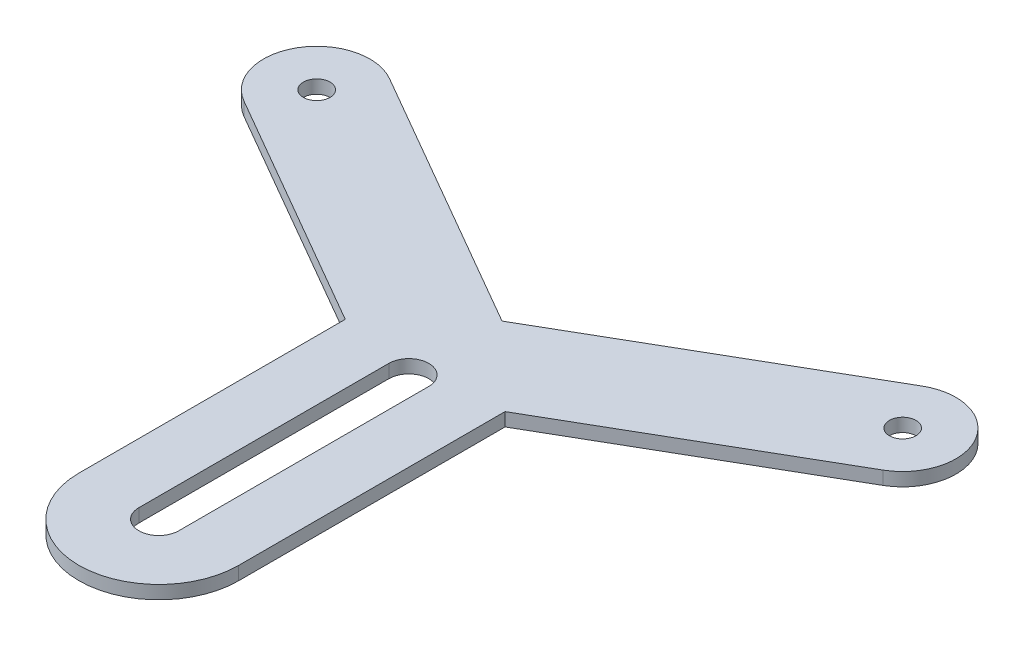
ISO-10303-21;
HEADER;
FILE_DESCRIPTION(('STEP AP214'),'2;1');
FILE_NAME('part.step','',(''),(''),'','','');
FILE_SCHEMA(('AUTOMOTIVE_DESIGN { 1 0 10303 214 1 1 1 1 }'));
ENDSEC;
DATA;
#1=APPLICATION_CONTEXT('core data for automotive mechanical design processes');
#2=APPLICATION_PROTOCOL_DEFINITION('international standard','automotive_design',2000,#1);
#3=PRODUCT_CONTEXT('',#1,'mechanical');
#4=PRODUCT('Part','Part','',(#3));
#5=PRODUCT_RELATED_PRODUCT_CATEGORY('part','',(#4));
#6=PRODUCT_DEFINITION_FORMATION('','',#4);
#7=PRODUCT_DEFINITION_CONTEXT('part definition',#1,'design');
#8=PRODUCT_DEFINITION('design','',#6,#7);
#9=PRODUCT_DEFINITION_SHAPE('','',#8);
#10=(LENGTH_UNIT() NAMED_UNIT(*) SI_UNIT(.MILLI.,.METRE.));
#11=(NAMED_UNIT(*) PLANE_ANGLE_UNIT() SI_UNIT($,.RADIAN.));
#12=(NAMED_UNIT(*) SI_UNIT($,.STERADIAN.) SOLID_ANGLE_UNIT());
#13=UNCERTAINTY_MEASURE_WITH_UNIT(LENGTH_MEASURE(1.E-05),#10,'distance_accuracy_value','');
#14=(GEOMETRIC_REPRESENTATION_CONTEXT(3) GLOBAL_UNCERTAINTY_ASSIGNED_CONTEXT((#13)) GLOBAL_UNIT_ASSIGNED_CONTEXT((#10,
#11,#12)) REPRESENTATION_CONTEXT('',''));
#15=CARTESIAN_POINT('',(0.,0.,0.));
#16=DIRECTION('',(0.,0.,1.));
#17=DIRECTION('',(1.,0.,0.));
#18=AXIS2_PLACEMENT_3D('',#15,#16,#17);
#19=CARTESIAN_POINT('',(-139.7,6.35,0.));
#20=DIRECTION('',(0.,1.,0.));
#21=DIRECTION('',(0.,0.,1.));
#22=AXIS2_PLACEMENT_3D('',#19,#20,#21);
#23=PLANE('',#22);
#24=CARTESIAN_POINT('',(-139.7,6.35,0.));
#25=DIRECTION('',(0.,1.,0.));
#26=DIRECTION('',(0.,0.,1.));
#27=AXIS2_PLACEMENT_3D('',#24,#25,#26);
#28=CIRCLE('',#27,6.35);
#29=CARTESIAN_POINT('',(-139.7,6.35,6.35));
#30=VERTEX_POINT('',#29);
#31=EDGE_CURVE('E170',#30,#30,#28,.T.);
#32=ORIENTED_EDGE('',*,*,#31,.F.);
#33=EDGE_LOOP('',(#32));
#34=FACE_BOUND('',#33,.T.);
#35=DIRECTION('',(-0.866025403784439,0.,0.5));
#36=VECTOR('',#35,1.);
#37=CARTESIAN_POINT('',(127.,6.35,-21.9970452561248));
#38=LINE('',#37,#36);
#39=CARTESIAN_POINT('',(127.,6.35,-21.9970452561247));
#40=VERTEX_POINT('',#39);
#41=CARTESIAN_POINT('',(0.,6.35,51.3264389309576));
#42=VERTEX_POINT('',#41);
#43=EDGE_CURVE('E176',#40,#42,#38,.T.);
#44=ORIENTED_EDGE('',*,*,#43,.T.);
#45=DIRECTION('',(-0.866025403784438,0.,-0.500000000000001));
#46=VECTOR('',#45,1.);
#47=CARTESIAN_POINT('',(-127.,6.35,-21.997045256125));
#48=LINE('',#47,#46);
#49=CARTESIAN_POINT('',(-127.,6.35,-21.997045256125));
#50=VERTEX_POINT('',#49);
#51=EDGE_CURVE('E179',#42,#50,#48,.T.);
#52=ORIENTED_EDGE('',*,*,#51,.T.);
#53=CARTESIAN_POINT('',(-139.7,6.35,0.));
#54=DIRECTION('',(0.,1.,0.));
#55=DIRECTION('',(0.,0.,1.));
#56=AXIS2_PLACEMENT_3D('',#53,#54,#55);
#57=CIRCLE('',#56,25.4);
#58=CARTESIAN_POINT('',(-152.4,6.35,21.9970452561247));
#59=VERTEX_POINT('',#58);
#60=EDGE_CURVE('E182',#50,#59,#57,.T.);
#61=ORIENTED_EDGE('',*,*,#60,.T.);
#62=DIRECTION('',(0.866025403784438,0.,0.500000000000002));
#63=VECTOR('',#62,1.);
#64=CARTESIAN_POINT('',(-152.4,6.35,21.9970452561245));
#65=LINE('',#64,#63);
#66=CARTESIAN_POINT('',(-38.1,6.35,87.988181024499));
#67=VERTEX_POINT('',#66);
#68=EDGE_CURVE('E184',#59,#67,#65,.T.);
#69=ORIENTED_EDGE('',*,*,#68,.T.);
#70=DIRECTION('',(0.,0.,1.));
#71=VECTOR('',#70,1.);
#72=CARTESIAN_POINT('',(-38.1,6.35,87.988181024499));
#73=LINE('',#72,#71);
#74=CARTESIAN_POINT('',(-38.1,6.35,214.988181024499));
#75=VERTEX_POINT('',#74);
#76=EDGE_CURVE('E186',#67,#75,#73,.T.);
#77=ORIENTED_EDGE('',*,*,#76,.T.);
#78=CARTESIAN_POINT('',(0.,6.35,214.988181024499));
#79=DIRECTION('',(0.,1.,0.));
#80=DIRECTION('',(0.,0.,1.));
#81=AXIS2_PLACEMENT_3D('',#78,#79,#80);
#82=CIRCLE('',#81,38.1);
#83=CARTESIAN_POINT('',(38.1000000000001,6.35,214.988181024499));
#84=VERTEX_POINT('',#83);
#85=EDGE_CURVE('E188',#75,#84,#82,.T.);
#86=ORIENTED_EDGE('',*,*,#85,.T.);
#87=DIRECTION('',(0.,0.,-1.));
#88=VECTOR('',#87,1.);
#89=CARTESIAN_POINT('',(38.1,6.35,87.988181024499));
#90=LINE('',#89,#88);
#91=CARTESIAN_POINT('',(38.1,6.35,87.988181024499));
#92=VERTEX_POINT('',#91);
#93=EDGE_CURVE('E190',#84,#92,#90,.T.);
#94=ORIENTED_EDGE('',*,*,#93,.T.);
#95=DIRECTION('',(0.866025403784439,0.,-0.5));
#96=VECTOR('',#95,1.);
#97=CARTESIAN_POINT('',(152.4,6.35,21.9970452561247));
#98=LINE('',#97,#96);
#99=CARTESIAN_POINT('',(152.4,6.35,21.9970452561247));
#100=VERTEX_POINT('',#99);
#101=EDGE_CURVE('E192',#92,#100,#98,.T.);
#102=ORIENTED_EDGE('',*,*,#101,.T.);
#103=CARTESIAN_POINT('',(139.7,6.35,0.));
#104=DIRECTION('',(0.,1.,0.));
#105=DIRECTION('',(0.,0.,-1.));
#106=AXIS2_PLACEMENT_3D('',#103,#104,#105);
#107=CIRCLE('',#106,25.4);
#108=EDGE_CURVE('E194',#100,#40,#107,.T.);
#109=ORIENTED_EDGE('',*,*,#108,.T.);
#110=EDGE_LOOP('',(#44,#52,#61,#69,#77,#86,#94,#102,#109));
#111=FACE_BOUND('',#110,.T.);
#112=CARTESIAN_POINT('',(139.7,6.35,0.));
#113=DIRECTION('',(0.,1.,0.));
#114=DIRECTION('',(0.,0.,1.));
#115=AXIS2_PLACEMENT_3D('',#112,#113,#114);
#116=CIRCLE('',#115,6.35);
#117=CARTESIAN_POINT('',(139.7,6.35,6.35));
#118=VERTEX_POINT('',#117);
#119=EDGE_CURVE('E164',#118,#118,#116,.T.);
#120=ORIENTED_EDGE('',*,*,#119,.F.);
#121=EDGE_LOOP('',(#120));
#122=FACE_BOUND('',#121,.T.);
#123=DIRECTION('',(0.,0.,-1.));
#124=VECTOR('',#123,1.);
#125=CARTESIAN_POINT('',(9.52500000000003,6.35,214.988181024499));
#126=LINE('',#125,#124);
#127=CARTESIAN_POINT('',(9.52500000000003,6.35,214.988181024499));
#128=VERTEX_POINT('',#127);
#129=CARTESIAN_POINT('',(9.525,6.35,95.7764389309576));
#130=VERTEX_POINT('',#129);
#131=EDGE_CURVE('E136',#128,#130,#126,.T.);
#132=ORIENTED_EDGE('',*,*,#131,.F.);
#133=CARTESIAN_POINT('',(0.,6.35,214.988181024499));
#134=DIRECTION('',(0.,1.,0.));
#135=DIRECTION('',(0.,0.,1.));
#136=AXIS2_PLACEMENT_3D('',#133,#134,#135);
#137=CIRCLE('',#136,9.525);
#138=CARTESIAN_POINT('',(-9.52499999999997,6.35,214.988181024499));
#139=VERTEX_POINT('',#138);
#140=EDGE_CURVE('E128',#139,#128,#137,.T.);
#141=ORIENTED_EDGE('',*,*,#140,.F.);
#142=DIRECTION('',(0.,0.,1.));
#143=VECTOR('',#142,1.);
#144=CARTESIAN_POINT('',(-9.52499999999997,6.35,214.988181024499));
#145=LINE('',#144,#143);
#146=CARTESIAN_POINT('',(-9.52500000000001,6.35,95.7764389309576));
#147=VERTEX_POINT('',#146);
#148=EDGE_CURVE('E150',#147,#139,#145,.T.);
#149=ORIENTED_EDGE('',*,*,#148,.F.);
#150=CARTESIAN_POINT('',(0.,6.35,95.7764389309576));
#151=DIRECTION('',(0.,1.,0.));
#152=DIRECTION('',(0.,0.,1.));
#153=AXIS2_PLACEMENT_3D('',#150,#151,#152);
#154=CIRCLE('',#153,9.525);
#155=EDGE_CURVE('E148',#130,#147,#154,.T.);
#156=ORIENTED_EDGE('',*,*,#155,.F.);
#157=EDGE_LOOP('',(#132,#141,#149,#156));
#158=FACE_BOUND('',#157,.T.);
#159=ADVANCED_FACE('F33',(#34,#111,#122,#158),#23,.T.);
#160=CARTESIAN_POINT('',(-139.7,0.,0.));
#161=DIRECTION('',(0.,1.,0.));
#162=DIRECTION('',(0.,0.,1.));
#163=AXIS2_PLACEMENT_3D('',#160,#161,#162);
#164=PLANE('',#163);
#165=CARTESIAN_POINT('',(139.7,0.,0.));
#166=DIRECTION('',(0.,1.,0.));
#167=DIRECTION('',(0.,0.,1.));
#168=AXIS2_PLACEMENT_3D('',#165,#166,#167);
#169=CIRCLE('',#168,6.35);
#170=CARTESIAN_POINT('',(139.7,0.,6.35));
#171=VERTEX_POINT('',#170);
#172=EDGE_CURVE('E144',#171,#171,#169,.T.);
#173=ORIENTED_EDGE('',*,*,#172,.T.);
#174=EDGE_LOOP('',(#173));
#175=FACE_BOUND('',#174,.T.);
#176=CARTESIAN_POINT('',(-139.7,0.,0.));
#177=DIRECTION('',(0.,1.,0.));
#178=DIRECTION('',(0.,0.,1.));
#179=AXIS2_PLACEMENT_3D('',#176,#177,#178);
#180=CIRCLE('',#179,6.35);
#181=CARTESIAN_POINT('',(-139.7,0.,6.35));
#182=VERTEX_POINT('',#181);
#183=EDGE_CURVE('E167',#182,#182,#180,.T.);
#184=ORIENTED_EDGE('',*,*,#183,.T.);
#185=EDGE_LOOP('',(#184));
#186=FACE_BOUND('',#185,.T.);
#187=DIRECTION('',(-0.866025403784439,0.,0.5));
#188=VECTOR('',#187,1.);
#189=CARTESIAN_POINT('',(127.,0.,-21.9970452561248));
#190=LINE('',#189,#188);
#191=CARTESIAN_POINT('',(127.,0.,-21.9970452561247));
#192=VERTEX_POINT('',#191);
#193=CARTESIAN_POINT('',(0.,0.,51.3264389309576));
#194=VERTEX_POINT('',#193);
#195=EDGE_CURVE('E173',#192,#194,#190,.T.);
#196=ORIENTED_EDGE('',*,*,#195,.F.);
#197=CARTESIAN_POINT('',(139.7,0.,0.));
#198=DIRECTION('',(0.,1.,0.));
#199=DIRECTION('',(0.,0.,-1.));
#200=AXIS2_PLACEMENT_3D('',#197,#198,#199);
#201=CIRCLE('',#200,25.4);
#202=CARTESIAN_POINT('',(152.4,0.,21.9970452561247));
#203=VERTEX_POINT('',#202);
#204=EDGE_CURVE('E180',#203,#192,#201,.T.);
#205=ORIENTED_EDGE('',*,*,#204,.F.);
#206=DIRECTION('',(0.866025403784439,0.,-0.5));
#207=VECTOR('',#206,1.);
#208=CARTESIAN_POINT('',(152.4,0.,21.9970452561247));
#209=LINE('',#208,#207);
#210=CARTESIAN_POINT('',(38.1,0.,87.988181024499));
#211=VERTEX_POINT('',#210);
#212=EDGE_CURVE('E211',#211,#203,#209,.T.);
#213=ORIENTED_EDGE('',*,*,#212,.F.);
#214=DIRECTION('',(0.,0.,-1.));
#215=VECTOR('',#214,1.);
#216=CARTESIAN_POINT('',(38.1,0.,87.988181024499));
#217=LINE('',#216,#215);
#218=CARTESIAN_POINT('',(38.1000000000001,0.,214.988181024499));
#219=VERTEX_POINT('',#218);
#220=EDGE_CURVE('E209',#219,#211,#217,.T.);
#221=ORIENTED_EDGE('',*,*,#220,.F.);
#222=CARTESIAN_POINT('',(0.,0.,214.988181024499));
#223=DIRECTION('',(0.,1.,0.));
#224=DIRECTION('',(0.,0.,1.));
#225=AXIS2_PLACEMENT_3D('',#222,#223,#224);
#226=CIRCLE('',#225,38.1);
#227=CARTESIAN_POINT('',(-38.1,0.,214.988181024499));
#228=VERTEX_POINT('',#227);
#229=EDGE_CURVE('E207',#228,#219,#226,.T.);
#230=ORIENTED_EDGE('',*,*,#229,.F.);
#231=DIRECTION('',(0.,0.,1.));
#232=VECTOR('',#231,1.);
#233=CARTESIAN_POINT('',(-38.1,0.,87.988181024499));
#234=LINE('',#233,#232);
#235=CARTESIAN_POINT('',(-38.1,0.,87.988181024499));
#236=VERTEX_POINT('',#235);
#237=EDGE_CURVE('E205',#236,#228,#234,.T.);
#238=ORIENTED_EDGE('',*,*,#237,.F.);
#239=DIRECTION('',(0.866025403784438,0.,0.500000000000002));
#240=VECTOR('',#239,1.);
#241=CARTESIAN_POINT('',(-152.4,0.,21.9970452561245));
#242=LINE('',#241,#240);
#243=CARTESIAN_POINT('',(-152.4,0.,21.9970452561247));
#244=VERTEX_POINT('',#243);
#245=EDGE_CURVE('E203',#244,#236,#242,.T.);
#246=ORIENTED_EDGE('',*,*,#245,.F.);
#247=CARTESIAN_POINT('',(-139.7,0.,0.));
#248=DIRECTION('',(0.,1.,0.));
#249=DIRECTION('',(0.,0.,1.));
#250=AXIS2_PLACEMENT_3D('',#247,#248,#249);
#251=CIRCLE('',#250,25.4);
#252=CARTESIAN_POINT('',(-127.,0.,-21.997045256125));
#253=VERTEX_POINT('',#252);
#254=EDGE_CURVE('E201',#253,#244,#251,.T.);
#255=ORIENTED_EDGE('',*,*,#254,.F.);
#256=DIRECTION('',(-0.866025403784438,0.,-0.500000000000001));
#257=VECTOR('',#256,1.);
#258=CARTESIAN_POINT('',(-127.,0.,-21.997045256125));
#259=LINE('',#258,#257);
#260=EDGE_CURVE('E199',#194,#253,#259,.T.);
#261=ORIENTED_EDGE('',*,*,#260,.F.);
#262=EDGE_LOOP('',(#196,#205,#213,#221,#230,#238,#246,#255,#261));
#263=FACE_BOUND('',#262,.T.);
#264=CARTESIAN_POINT('',(0.,0.,214.988181024499));
#265=DIRECTION('',(0.,1.,0.));
#266=DIRECTION('',(0.,0.,1.));
#267=AXIS2_PLACEMENT_3D('',#264,#265,#266);
#268=CIRCLE('',#267,9.525);
#269=CARTESIAN_POINT('',(-9.52499999999998,0.,214.988181024499));
#270=VERTEX_POINT('',#269);
#271=CARTESIAN_POINT('',(9.52500000000003,0.,214.988181024499));
#272=VERTEX_POINT('',#271);
#273=EDGE_CURVE('E56',#270,#272,#268,.T.);
#274=ORIENTED_EDGE('',*,*,#273,.T.);
#275=DIRECTION('',(0.,0.,-1.));
#276=VECTOR('',#275,1.);
#277=CARTESIAN_POINT('',(9.52500000000003,0.,214.988181024499));
#278=LINE('',#277,#276);
#279=CARTESIAN_POINT('',(9.525,0.,95.7764389309576));
#280=VERTEX_POINT('',#279);
#281=EDGE_CURVE('E143',#272,#280,#278,.T.);
#282=ORIENTED_EDGE('',*,*,#281,.T.);
#283=CARTESIAN_POINT('',(0.,0.,95.7764389309576));
#284=DIRECTION('',(0.,1.,0.));
#285=DIRECTION('',(0.,0.,1.));
#286=AXIS2_PLACEMENT_3D('',#283,#284,#285);
#287=CIRCLE('',#286,9.525);
#288=CARTESIAN_POINT('',(-9.525,0.,95.7764389309576));
#289=VERTEX_POINT('',#288);
#290=EDGE_CURVE('E156',#280,#289,#287,.T.);
#291=ORIENTED_EDGE('',*,*,#290,.T.);
#292=DIRECTION('',(0.,0.,1.));
#293=VECTOR('',#292,1.);
#294=CARTESIAN_POINT('',(-9.52499999999997,0.,214.988181024499));
#295=LINE('',#294,#293);
#296=EDGE_CURVE('E137',#289,#270,#295,.T.);
#297=ORIENTED_EDGE('',*,*,#296,.T.);
#298=EDGE_LOOP('',(#274,#282,#291,#297));
#299=FACE_BOUND('',#298,.T.);
#300=ADVANCED_FACE('F244',(#175,#186,#263,#299),#164,.F.);
#301=CARTESIAN_POINT('',(127.,6.35,-21.9970452561248));
#302=DIRECTION('',(0.5,0.,0.866025403784439));
#303=DIRECTION('',(0.866025403784439,0.,-0.5));
#304=AXIS2_PLACEMENT_3D('',#301,#302,#303);
#305=PLANE('',#304);
#306=ORIENTED_EDGE('',*,*,#195,.T.);
#307=DIRECTION('',(0.,-1.,0.));
#308=VECTOR('',#307,1.);
#309=CARTESIAN_POINT('',(0.,6.35,51.3264389309576));
#310=LINE('',#309,#308);
#311=EDGE_CURVE('E11',#42,#194,#310,.T.);
#312=ORIENTED_EDGE('',*,*,#311,.F.);
#313=ORIENTED_EDGE('',*,*,#43,.F.);
#314=DIRECTION('',(0.,-1.,0.));
#315=VECTOR('',#314,1.);
#316=CARTESIAN_POINT('',(127.,6.35,-21.9970452561247));
#317=LINE('',#316,#315);
#318=EDGE_CURVE('E196',#40,#192,#317,.T.);
#319=ORIENTED_EDGE('',*,*,#318,.T.);
#320=EDGE_LOOP('',(#306,#312,#313,#319));
#321=FACE_BOUND('',#320,.T.);
#322=ADVANCED_FACE('F35',(#321),#305,.F.);
#323=CARTESIAN_POINT('',(-127.,6.35,-21.997045256125));
#324=DIRECTION('',(-0.500000000000001,0.,0.866025403784438));
#325=DIRECTION('',(0.866025403784438,0.,0.500000000000001));
#326=AXIS2_PLACEMENT_3D('',#323,#324,#325);
#327=PLANE('',#326);
#328=ORIENTED_EDGE('',*,*,#260,.T.);
#329=DIRECTION('',(0.,-1.,0.));
#330=VECTOR('',#329,1.);
#331=CARTESIAN_POINT('',(-127.,6.35,-21.997045256125));
#332=LINE('',#331,#330);
#333=EDGE_CURVE('E41',#50,#253,#332,.T.);
#334=ORIENTED_EDGE('',*,*,#333,.F.);
#335=ORIENTED_EDGE('',*,*,#51,.F.);
#336=ORIENTED_EDGE('',*,*,#311,.T.);
#337=EDGE_LOOP('',(#328,#334,#335,#336));
#338=FACE_BOUND('',#337,.T.);
#339=ADVANCED_FACE('F262',(#338),#327,.F.);
#340=CARTESIAN_POINT('',(-139.7,6.35,0.));
#341=DIRECTION('',(0.,-1.,0.));
#342=DIRECTION('',(0.,0.,-1.));
#343=AXIS2_PLACEMENT_3D('',#340,#341,#342);
#344=CYLINDRICAL_SURFACE('',#343,25.4);
#345=ORIENTED_EDGE('',*,*,#254,.T.);
#346=DIRECTION('',(0.,-1.,0.));
#347=VECTOR('',#346,1.);
#348=CARTESIAN_POINT('',(-152.4,6.35,21.9970452561247));
#349=LINE('',#348,#347);
#350=EDGE_CURVE('E231',#59,#244,#349,.T.);
#351=ORIENTED_EDGE('',*,*,#350,.F.);
#352=ORIENTED_EDGE('',*,*,#60,.F.);
#353=ORIENTED_EDGE('',*,*,#333,.T.);
#354=EDGE_LOOP('',(#345,#351,#352,#353));
#355=FACE_BOUND('',#354,.T.);
#356=ADVANCED_FACE('F238',(#355),#344,.T.);
#357=CARTESIAN_POINT('',(-152.4,6.35,21.9970452561245));
#358=DIRECTION('',(0.500000000000002,0.,-0.866025403784437));
#359=DIRECTION('',(-0.866025403784438,0.,-0.500000000000002));
#360=AXIS2_PLACEMENT_3D('',#357,#358,#359);
#361=PLANE('',#360);
#362=ORIENTED_EDGE('',*,*,#245,.T.);
#363=DIRECTION('',(0.,-1.,0.));
#364=VECTOR('',#363,1.);
#365=CARTESIAN_POINT('',(-38.1,6.35,87.988181024499));
#366=LINE('',#365,#364);
#367=EDGE_CURVE('E228',#67,#236,#366,.T.);
#368=ORIENTED_EDGE('',*,*,#367,.F.);
#369=ORIENTED_EDGE('',*,*,#68,.F.);
#370=ORIENTED_EDGE('',*,*,#350,.T.);
#371=EDGE_LOOP('',(#362,#368,#369,#370));
#372=FACE_BOUND('',#371,.T.);
#373=ADVANCED_FACE('F250',(#372),#361,.F.);
#374=CARTESIAN_POINT('',(-38.1,6.35,87.988181024499));
#375=DIRECTION('',(1.,0.,0.));
#376=DIRECTION('',(0.,0.,-1.));
#377=AXIS2_PLACEMENT_3D('',#374,#375,#376);
#378=PLANE('',#377);
#379=ORIENTED_EDGE('',*,*,#237,.T.);
#380=DIRECTION('',(0.,-1.,0.));
#381=VECTOR('',#380,1.);
#382=CARTESIAN_POINT('',(-38.1,6.35,214.988181024499));
#383=LINE('',#382,#381);
#384=EDGE_CURVE('E225',#75,#228,#383,.T.);
#385=ORIENTED_EDGE('',*,*,#384,.F.);
#386=ORIENTED_EDGE('',*,*,#76,.F.);
#387=ORIENTED_EDGE('',*,*,#367,.T.);
#388=EDGE_LOOP('',(#379,#385,#386,#387));
#389=FACE_BOUND('',#388,.T.);
#390=ADVANCED_FACE('F254',(#389),#378,.F.);
#391=CARTESIAN_POINT('',(0.,6.35,214.988181024499));
#392=DIRECTION('',(0.,-1.,0.));
#393=DIRECTION('',(0.,0.,-1.));
#394=AXIS2_PLACEMENT_3D('',#391,#392,#393);
#395=CYLINDRICAL_SURFACE('',#394,38.1);
#396=ORIENTED_EDGE('',*,*,#229,.T.);
#397=DIRECTION('',(0.,-1.,0.));
#398=VECTOR('',#397,1.);
#399=CARTESIAN_POINT('',(38.1000000000001,6.35,214.988181024499));
#400=LINE('',#399,#398);
#401=EDGE_CURVE('E222',#84,#219,#400,.T.);
#402=ORIENTED_EDGE('',*,*,#401,.F.);
#403=ORIENTED_EDGE('',*,*,#85,.F.);
#404=ORIENTED_EDGE('',*,*,#384,.T.);
#405=EDGE_LOOP('',(#396,#402,#403,#404));
#406=FACE_BOUND('',#405,.T.);
#407=ADVANCED_FACE('F280',(#406),#395,.T.);
#408=CARTESIAN_POINT('',(38.1,6.35,87.988181024499));
#409=DIRECTION('',(-1.,0.,0.));
#410=DIRECTION('',(0.,0.,1.));
#411=AXIS2_PLACEMENT_3D('',#408,#409,#410);
#412=PLANE('',#411);
#413=ORIENTED_EDGE('',*,*,#220,.T.);
#414=DIRECTION('',(0.,-1.,0.));
#415=VECTOR('',#414,1.);
#416=CARTESIAN_POINT('',(38.1,6.35,87.988181024499));
#417=LINE('',#416,#415);
#418=EDGE_CURVE('E219',#92,#211,#417,.T.);
#419=ORIENTED_EDGE('',*,*,#418,.F.);
#420=ORIENTED_EDGE('',*,*,#93,.F.);
#421=ORIENTED_EDGE('',*,*,#401,.T.);
#422=EDGE_LOOP('',(#413,#419,#420,#421));
#423=FACE_BOUND('',#422,.T.);
#424=ADVANCED_FACE('F278',(#423),#412,.F.);
#425=CARTESIAN_POINT('',(152.4,6.35,21.9970452561247));
#426=DIRECTION('',(-0.5,0.,-0.866025403784439));
#427=DIRECTION('',(-0.866025403784439,0.,0.5));
#428=AXIS2_PLACEMENT_3D('',#425,#426,#427);
#429=PLANE('',#428);
#430=ORIENTED_EDGE('',*,*,#212,.T.);
#431=DIRECTION('',(0.,-1.,0.));
#432=VECTOR('',#431,1.);
#433=CARTESIAN_POINT('',(152.4,6.35,21.9970452561247));
#434=LINE('',#433,#432);
#435=EDGE_CURVE('E216',#100,#203,#434,.T.);
#436=ORIENTED_EDGE('',*,*,#435,.F.);
#437=ORIENTED_EDGE('',*,*,#101,.F.);
#438=ORIENTED_EDGE('',*,*,#418,.T.);
#439=EDGE_LOOP('',(#430,#436,#437,#438));
#440=FACE_BOUND('',#439,.T.);
#441=ADVANCED_FACE('F274',(#440),#429,.F.);
#442=CARTESIAN_POINT('',(139.7,6.35,0.));
#443=DIRECTION('',(0.,-1.,0.));
#444=DIRECTION('',(0.,0.,-1.));
#445=AXIS2_PLACEMENT_3D('',#442,#443,#444);
#446=CYLINDRICAL_SURFACE('',#445,25.4);
#447=ORIENTED_EDGE('',*,*,#204,.T.);
#448=ORIENTED_EDGE('',*,*,#318,.F.);
#449=ORIENTED_EDGE('',*,*,#108,.F.);
#450=ORIENTED_EDGE('',*,*,#435,.T.);
#451=EDGE_LOOP('',(#447,#448,#449,#450));
#452=FACE_BOUND('',#451,.T.);
#453=ADVANCED_FACE('F269',(#452),#446,.T.);
#454=CARTESIAN_POINT('',(-139.7,6.35,0.));
#455=DIRECTION('',(0.,-1.,0.));
#456=DIRECTION('',(0.,0.,-1.));
#457=AXIS2_PLACEMENT_3D('',#454,#455,#456);
#458=CYLINDRICAL_SURFACE('',#457,6.35);
#459=ORIENTED_EDGE('',*,*,#31,.T.);
#460=EDGE_LOOP('',(#459));
#461=FACE_BOUND('',#460,.T.);
#462=ORIENTED_EDGE('',*,*,#183,.F.);
#463=EDGE_LOOP('',(#462));
#464=FACE_BOUND('',#463,.T.);
#465=ADVANCED_FACE('F299',(#461,#464),#458,.F.);
#466=CARTESIAN_POINT('',(139.7,6.35,0.));
#467=DIRECTION('',(0.,-1.,0.));
#468=DIRECTION('',(0.,0.,-1.));
#469=AXIS2_PLACEMENT_3D('',#466,#467,#468);
#470=CYLINDRICAL_SURFACE('',#469,6.35);
#471=ORIENTED_EDGE('',*,*,#119,.T.);
#472=EDGE_LOOP('',(#471));
#473=FACE_BOUND('',#472,.T.);
#474=ORIENTED_EDGE('',*,*,#172,.F.);
#475=EDGE_LOOP('',(#474));
#476=FACE_BOUND('',#475,.T.);
#477=ADVANCED_FACE('F319',(#473,#476),#470,.F.);
#478=CARTESIAN_POINT('',(0.,6.35,214.988181024499));
#479=DIRECTION('',(0.,-1.,0.));
#480=DIRECTION('',(0.,0.,-1.));
#481=AXIS2_PLACEMENT_3D('',#478,#479,#480);
#482=CYLINDRICAL_SURFACE('',#481,9.525);
#483=ORIENTED_EDGE('',*,*,#273,.F.);
#484=DIRECTION('',(0.,-1.,0.));
#485=VECTOR('',#484,1.);
#486=CARTESIAN_POINT('',(-9.52499999999997,6.35,214.988181024499));
#487=LINE('',#486,#485);
#488=EDGE_CURVE('E132',#139,#270,#487,.T.);
#489=ORIENTED_EDGE('',*,*,#488,.F.);
#490=ORIENTED_EDGE('',*,*,#140,.T.);
#491=DIRECTION('',(0.,-1.,0.));
#492=VECTOR('',#491,1.);
#493=CARTESIAN_POINT('',(9.52500000000003,6.35,214.988181024499));
#494=LINE('',#493,#492);
#495=EDGE_CURVE('E131',#128,#272,#494,.T.);
#496=ORIENTED_EDGE('',*,*,#495,.T.);
#497=EDGE_LOOP('',(#483,#489,#490,#496));
#498=FACE_BOUND('',#497,.T.);
#499=ADVANCED_FACE('F130',(#498),#482,.F.);
#500=CARTESIAN_POINT('',(9.52500000000003,6.35,214.988181024499));
#501=DIRECTION('',(-1.,0.,0.));
#502=DIRECTION('',(0.,0.,1.));
#503=AXIS2_PLACEMENT_3D('',#500,#501,#502);
#504=PLANE('',#503);
#505=ORIENTED_EDGE('',*,*,#281,.F.);
#506=ORIENTED_EDGE('',*,*,#495,.F.);
#507=ORIENTED_EDGE('',*,*,#131,.T.);
#508=DIRECTION('',(0.,-1.,0.));
#509=VECTOR('',#508,1.);
#510=CARTESIAN_POINT('',(9.525,6.35,95.7764389309576));
#511=LINE('',#510,#509);
#512=EDGE_CURVE('E145',#130,#280,#511,.T.);
#513=ORIENTED_EDGE('',*,*,#512,.T.);
#514=EDGE_LOOP('',(#505,#506,#507,#513));
#515=FACE_BOUND('',#514,.T.);
#516=ADVANCED_FACE('F140',(#515),#504,.T.);
#517=CARTESIAN_POINT('',(0.,6.35,95.7764389309576));
#518=DIRECTION('',(0.,-1.,0.));
#519=DIRECTION('',(0.,0.,-1.));
#520=AXIS2_PLACEMENT_3D('',#517,#518,#519);
#521=CYLINDRICAL_SURFACE('',#520,9.525);
#522=ORIENTED_EDGE('',*,*,#290,.F.);
#523=ORIENTED_EDGE('',*,*,#512,.F.);
#524=ORIENTED_EDGE('',*,*,#155,.T.);
#525=DIRECTION('',(0.,-1.,0.));
#526=VECTOR('',#525,1.);
#527=CARTESIAN_POINT('',(-9.525,6.35,95.7764389309576));
#528=LINE('',#527,#526);
#529=EDGE_CURVE('E48',#147,#289,#528,.T.);
#530=ORIENTED_EDGE('',*,*,#529,.T.);
#531=EDGE_LOOP('',(#522,#523,#524,#530));
#532=FACE_BOUND('',#531,.T.);
#533=ADVANCED_FACE('F338',(#532),#521,.F.);
#534=CARTESIAN_POINT('',(-9.52499999999997,6.35,214.988181024499));
#535=DIRECTION('',(1.,0.,0.));
#536=DIRECTION('',(0.,0.,-1.));
#537=AXIS2_PLACEMENT_3D('',#534,#535,#536);
#538=PLANE('',#537);
#539=ORIENTED_EDGE('',*,*,#296,.F.);
#540=ORIENTED_EDGE('',*,*,#529,.F.);
#541=ORIENTED_EDGE('',*,*,#148,.T.);
#542=ORIENTED_EDGE('',*,*,#488,.T.);
#543=EDGE_LOOP('',(#539,#540,#541,#542));
#544=FACE_BOUND('',#543,.T.);
#545=ADVANCED_FACE('F345',(#544),#538,.T.);
#546=CLOSED_SHELL('',(#159,#300,#322,#339,#356,#373,#390,#407,#424,#441,#453,#465,#477,#499,
#516,#533,#545));
#547=MANIFOLD_SOLID_BREP('B2',#546);
#548=ADVANCED_BREP_SHAPE_REPRESENTATION('',(#18,#547),#14);
#549=SHAPE_DEFINITION_REPRESENTATION(#9,#548);
ENDSEC;
END-ISO-10303-21;
